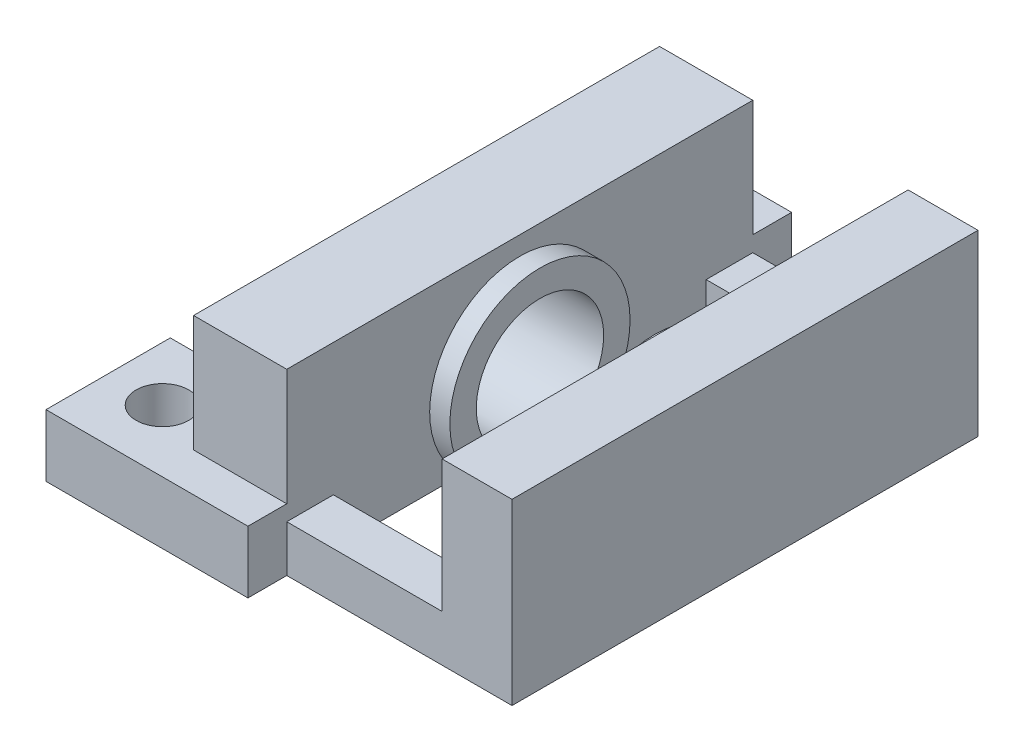
ISO-10303-21;
HEADER;
FILE_DESCRIPTION(('STEP AP214'),'2;1');
FILE_NAME('part.step','',(''),(''),'','','');
FILE_SCHEMA(('AUTOMOTIVE_DESIGN { 1 0 10303 214 1 1 1 1 }'));
ENDSEC;
DATA;
#1=APPLICATION_CONTEXT('core data for automotive mechanical design processes');
#2=APPLICATION_PROTOCOL_DEFINITION('international standard','automotive_design',2000,#1);
#3=PRODUCT_CONTEXT('',#1,'mechanical');
#4=PRODUCT('Part','Part','',(#3));
#5=PRODUCT_RELATED_PRODUCT_CATEGORY('part','',(#4));
#6=PRODUCT_DEFINITION_FORMATION('','',#4);
#7=PRODUCT_DEFINITION_CONTEXT('part definition',#1,'design');
#8=PRODUCT_DEFINITION('design','',#6,#7);
#9=PRODUCT_DEFINITION_SHAPE('','',#8);
#10=(LENGTH_UNIT() NAMED_UNIT(*) SI_UNIT(.MILLI.,.METRE.));
#11=(NAMED_UNIT(*) PLANE_ANGLE_UNIT() SI_UNIT($,.RADIAN.));
#12=(NAMED_UNIT(*) SI_UNIT($,.STERADIAN.) SOLID_ANGLE_UNIT());
#13=UNCERTAINTY_MEASURE_WITH_UNIT(LENGTH_MEASURE(1.E-05),#10,'distance_accuracy_value','');
#14=(GEOMETRIC_REPRESENTATION_CONTEXT(3) GLOBAL_UNCERTAINTY_ASSIGNED_CONTEXT((#13)) GLOBAL_UNIT_ASSIGNED_CONTEXT((#10,
#11,#12)) REPRESENTATION_CONTEXT('',''));
#15=CARTESIAN_POINT('',(0.,0.,0.));
#16=DIRECTION('',(0.,0.,1.));
#17=DIRECTION('',(1.,0.,0.));
#18=AXIS2_PLACEMENT_3D('',#15,#16,#17);
#19=CARTESIAN_POINT('',(163.,9.5,-85.));
#20=DIRECTION('',(1.,0.,0.));
#21=DIRECTION('',(0.,1.,0.));
#22=AXIS2_PLACEMENT_3D('',#19,#20,#21);
#23=PLANE('',#22);
#24=CARTESIAN_POINT('',(163.,9.5,-85.));
#25=DIRECTION('',(1.,0.,0.));
#26=DIRECTION('',(0.,0.,-1.));
#27=AXIS2_PLACEMENT_3D('',#24,#25,#26);
#28=CIRCLE('',#27,4.1);
#29=CARTESIAN_POINT('',(163.,9.5,-89.1));
#30=VERTEX_POINT('',#29);
#31=EDGE_CURVE('E11',#30,#30,#28,.T.);
#32=ORIENTED_EDGE('',*,*,#31,.F.);
#33=EDGE_LOOP('',(#32));
#34=FACE_BOUND('',#33,.T.);
#35=ADVANCED_FACE('F17',(#34),#23,.F.);
#36=CARTESIAN_POINT('',(143.,9.5,-85.));
#37=DIRECTION('',(-1.,0.,0.));
#38=DIRECTION('',(0.,0.,-1.));
#39=AXIS2_PLACEMENT_3D('',#36,#37,#38);
#40=CYLINDRICAL_SURFACE('',#39,4.1);
#41=CARTESIAN_POINT('',(158.7,9.5,-85.));
#42=DIRECTION('',(-1.,0.,0.));
#43=DIRECTION('',(0.,0.,-1.));
#44=AXIS2_PLACEMENT_3D('',#41,#42,#43);
#45=CIRCLE('',#44,4.1);
#46=CARTESIAN_POINT('',(158.7,9.5,-89.1));
#47=VERTEX_POINT('',#46);
#48=EDGE_CURVE('E346',#47,#47,#45,.T.);
#49=ORIENTED_EDGE('',*,*,#48,.T.);
#50=DIRECTION('',(1.,0.,0.));
#51=VECTOR('',#50,1.);
#52=CARTESIAN_POINT('',(143.,9.5,-89.1));
#53=LINE('',#52,#51);
#54=EDGE_CURVE('E25',#47,#30,#53,.T.);
#55=ORIENTED_EDGE('',*,*,#54,.T.);
#56=ORIENTED_EDGE('',*,*,#31,.T.);
#57=ORIENTED_EDGE('',*,*,#54,.F.);
#58=EDGE_LOOP('',(#49,#55,#56,#57));
#59=FACE_BOUND('',#58,.T.);
#60=ADVANCED_FACE('F355',(#59),#40,.F.);
#61=CARTESIAN_POINT('',(158.7,9.5,-85.));
#62=DIRECTION('',(1.,0.,0.));
#63=DIRECTION('',(0.,1.,0.));
#64=AXIS2_PLACEMENT_3D('',#61,#62,#63);
#65=PLANE('',#64);
#66=ORIENTED_EDGE('',*,*,#48,.F.);
#67=EDGE_LOOP('',(#66));
#68=FACE_BOUND('',#67,.T.);
#69=CARTESIAN_POINT('',(158.7,9.5,-85.));
#70=DIRECTION('',(1.,0.,0.));
#71=DIRECTION('',(0.,0.,-1.));
#72=AXIS2_PLACEMENT_3D('',#69,#70,#71);
#73=CIRCLE('',#72,5.8);
#74=CARTESIAN_POINT('',(158.7,9.5,-90.8));
#75=VERTEX_POINT('',#74);
#76=EDGE_CURVE('E350',#75,#75,#73,.T.);
#77=ORIENTED_EDGE('',*,*,#76,.F.);
#78=EDGE_LOOP('',(#77));
#79=FACE_BOUND('',#78,.T.);
#80=ADVANCED_FACE('F354',(#68,#79),#65,.F.);
#81=CARTESIAN_POINT('',(151.3,9.5,-85.));
#82=DIRECTION('',(1.,0.,0.));
#83=DIRECTION('',(0.,1.,0.));
#84=AXIS2_PLACEMENT_3D('',#81,#82,#83);
#85=PLANE('',#84);
#86=CARTESIAN_POINT('',(151.3,9.5,-85.));
#87=DIRECTION('',(-1.,0.,0.));
#88=DIRECTION('',(0.,0.,-1.));
#89=AXIS2_PLACEMENT_3D('',#86,#87,#88);
#90=CIRCLE('',#89,4.1);
#91=CARTESIAN_POINT('',(151.3,9.5,-89.1));
#92=VERTEX_POINT('',#91);
#93=EDGE_CURVE('E194',#92,#92,#90,.T.);
#94=ORIENTED_EDGE('',*,*,#93,.T.);
#95=EDGE_LOOP('',(#94));
#96=FACE_BOUND('',#95,.T.);
#97=CARTESIAN_POINT('',(151.3,9.5,-85.));
#98=DIRECTION('',(1.,0.,0.));
#99=DIRECTION('',(0.,0.,-1.));
#100=AXIS2_PLACEMENT_3D('',#97,#98,#99);
#101=CIRCLE('',#100,5.8);
#102=CARTESIAN_POINT('',(151.3,9.5,-90.8));
#103=VERTEX_POINT('',#102);
#104=EDGE_CURVE('E205',#103,#103,#101,.T.);
#105=ORIENTED_EDGE('',*,*,#104,.T.);
#106=EDGE_LOOP('',(#105));
#107=FACE_BOUND('',#106,.T.);
#108=ADVANCED_FACE('F359',(#96,#107),#85,.T.);
#109=CARTESIAN_POINT('',(160.,9.5,-85.));
#110=DIRECTION('',(1.,0.,0.));
#111=DIRECTION('',(0.,0.,-1.));
#112=AXIS2_PLACEMENT_3D('',#109,#110,#111);
#113=CYLINDRICAL_SURFACE('',#112,5.8);
#114=CARTESIAN_POINT('',(160.,9.5,-85.));
#115=DIRECTION('',(1.,0.,0.));
#116=DIRECTION('',(0.,0.,-1.));
#117=AXIS2_PLACEMENT_3D('',#114,#115,#116);
#118=CIRCLE('',#117,5.8);
#119=CARTESIAN_POINT('',(160.,9.5,-90.8));
#120=VERTEX_POINT('',#119);
#121=CARTESIAN_POINT('',(160.,5.,-81.34076510729));
#122=VERTEX_POINT('',#121);
#123=EDGE_CURVE('E320',#120,#122,#118,.T.);
#124=ORIENTED_EDGE('',*,*,#123,.F.);
#125=DIRECTION('',(-1.,0.,0.));
#126=VECTOR('',#125,1.);
#127=CARTESIAN_POINT('',(160.,9.5,-90.8));
#128=LINE('',#127,#126);
#129=EDGE_CURVE('E345',#120,#75,#128,.T.);
#130=ORIENTED_EDGE('',*,*,#129,.T.);
#131=ORIENTED_EDGE('',*,*,#76,.T.);
#132=ORIENTED_EDGE('',*,*,#129,.F.);
#133=CARTESIAN_POINT('',(160.,9.5,-85.));
#134=DIRECTION('',(1.,0.,0.));
#135=DIRECTION('',(0.,0.,-1.));
#136=AXIS2_PLACEMENT_3D('',#133,#134,#135);
#137=CIRCLE('',#136,5.8);
#138=CARTESIAN_POINT('',(160.,5.,-88.6592348927));
#139=VERTEX_POINT('',#138);
#140=EDGE_CURVE('E311',#139,#120,#137,.T.);
#141=ORIENTED_EDGE('',*,*,#140,.F.);
#142=CARTESIAN_POINT('',(160.,9.5,-85.));
#143=DIRECTION('',(1.,0.,0.));
#144=DIRECTION('',(0.,0.,-1.));
#145=AXIS2_PLACEMENT_3D('',#142,#143,#144);
#146=CIRCLE('',#145,5.8);
#147=EDGE_CURVE('E324',#122,#139,#146,.T.);
#148=ORIENTED_EDGE('',*,*,#147,.F.);
#149=EDGE_LOOP('',(#124,#130,#131,#132,#141,#148));
#150=FACE_BOUND('',#149,.T.);
#151=ADVANCED_FACE('F364',(#150),#113,.T.);
#152=CARTESIAN_POINT('',(162.25,16.5,-85.));
#153=DIRECTION('',(0.,1.,0.));
#154=DIRECTION('',(0.,0.,-1.));
#155=AXIS2_PLACEMENT_3D('',#152,#153,#154);
#156=PLANE('',#155);
#157=DIRECTION('',(1.,0.,0.));
#158=VECTOR('',#157,1.);
#159=CARTESIAN_POINT('',(160.,16.5,-70.));
#160=LINE('',#159,#158);
#161=CARTESIAN_POINT('',(160.,16.5,-70.));
#162=VERTEX_POINT('',#161);
#163=CARTESIAN_POINT('',(164.5,16.5,-70.));
#164=VERTEX_POINT('',#163);
#165=EDGE_CURVE('E529',#162,#164,#160,.T.);
#166=ORIENTED_EDGE('',*,*,#165,.T.);
#167=DIRECTION('',(0.,0.,-1.));
#168=VECTOR('',#167,1.);
#169=CARTESIAN_POINT('',(164.5,16.5,-70.));
#170=LINE('',#169,#168);
#171=CARTESIAN_POINT('',(164.5,16.5,-100.));
#172=VERTEX_POINT('',#171);
#173=EDGE_CURVE('E265',#164,#172,#170,.T.);
#174=ORIENTED_EDGE('',*,*,#173,.T.);
#175=DIRECTION('',(-1.,0.,0.));
#176=VECTOR('',#175,1.);
#177=CARTESIAN_POINT('',(164.5,16.5,-100.));
#178=LINE('',#177,#176);
#179=CARTESIAN_POINT('',(160.,16.5,-100.));
#180=VERTEX_POINT('',#179);
#181=EDGE_CURVE('E287',#172,#180,#178,.T.);
#182=ORIENTED_EDGE('',*,*,#181,.T.);
#183=DIRECTION('',(0.,0.,1.));
#184=VECTOR('',#183,1.);
#185=CARTESIAN_POINT('',(160.,16.5,-100.));
#186=LINE('',#185,#184);
#187=EDGE_CURVE('E318',#180,#162,#186,.T.);
#188=ORIENTED_EDGE('',*,*,#187,.T.);
#189=EDGE_LOOP('',(#166,#174,#182,#188));
#190=FACE_BOUND('',#189,.T.);
#191=ADVANCED_FACE('F550',(#190),#156,.T.);
#192=CARTESIAN_POINT('',(154.25,8.,-71.5));
#193=DIRECTION('',(0.,1.,0.));
#194=DIRECTION('',(0.,0.,-1.));
#195=AXIS2_PLACEMENT_3D('',#192,#193,#194);
#196=PLANE('',#195);
#197=DIRECTION('',(0.,0.,-1.));
#198=VECTOR('',#197,1.);
#199=CARTESIAN_POINT('',(150.,8.,-70.75));
#200=LINE('',#199,#198);
#201=CARTESIAN_POINT('',(150.,8.,-70.));
#202=VERTEX_POINT('',#201);
#203=CARTESIAN_POINT('',(150.,8.,-73.));
#204=VERTEX_POINT('',#203);
#205=EDGE_CURVE('E516',#202,#204,#200,.T.);
#206=ORIENTED_EDGE('',*,*,#205,.F.);
#207=DIRECTION('',(1.,0.,0.));
#208=VECTOR('',#207,1.);
#209=CARTESIAN_POINT('',(144.,8.,-70.));
#210=LINE('',#209,#208);
#211=CARTESIAN_POINT('',(160.,8.,-70.));
#212=VERTEX_POINT('',#211);
#213=EDGE_CURVE('E267',#202,#212,#210,.T.);
#214=ORIENTED_EDGE('',*,*,#213,.T.);
#215=DIRECTION('',(0.,0.,1.));
#216=VECTOR('',#215,1.);
#217=CARTESIAN_POINT('',(160.,8.,-85.75));
#218=LINE('',#217,#216);
#219=CARTESIAN_POINT('',(160.,8.,-73.));
#220=VERTEX_POINT('',#219);
#221=EDGE_CURVE('E325',#220,#212,#218,.T.);
#222=ORIENTED_EDGE('',*,*,#221,.F.);
#223=DIRECTION('',(-1.,0.,0.));
#224=VECTOR('',#223,1.);
#225=CARTESIAN_POINT('',(164.5,8.,-73.));
#226=LINE('',#225,#224);
#227=EDGE_CURVE('E310',#220,#204,#226,.T.);
#228=ORIENTED_EDGE('',*,*,#227,.T.);
#229=EDGE_LOOP('',(#206,#214,#222,#228));
#230=FACE_BOUND('',#229,.T.);
#231=ADVANCED_FACE('F868',(#230),#196,.T.);
#232=CARTESIAN_POINT('',(154.25,8.,-98.5));
#233=DIRECTION('',(0.,1.,0.));
#234=DIRECTION('',(0.,0.,-1.));
#235=AXIS2_PLACEMENT_3D('',#232,#233,#234);
#236=PLANE('',#235);
#237=DIRECTION('',(0.,0.,-1.));
#238=VECTOR('',#237,1.);
#239=CARTESIAN_POINT('',(150.,8.,-84.25));
#240=LINE('',#239,#238);
#241=CARTESIAN_POINT('',(150.,8.,-97.));
#242=VERTEX_POINT('',#241);
#243=CARTESIAN_POINT('',(150.,8.,-100.));
#244=VERTEX_POINT('',#243);
#245=EDGE_CURVE('E397',#242,#244,#240,.T.);
#246=ORIENTED_EDGE('',*,*,#245,.F.);
#247=DIRECTION('',(1.,0.,0.));
#248=VECTOR('',#247,1.);
#249=CARTESIAN_POINT('',(144.,8.,-97.));
#250=LINE('',#249,#248);
#251=CARTESIAN_POINT('',(160.,8.,-97.));
#252=VERTEX_POINT('',#251);
#253=EDGE_CURVE('E303',#242,#252,#250,.T.);
#254=ORIENTED_EDGE('',*,*,#253,.T.);
#255=DIRECTION('',(0.,0.,1.));
#256=VECTOR('',#255,1.);
#257=CARTESIAN_POINT('',(160.,8.,-99.25));
#258=LINE('',#257,#256);
#259=CARTESIAN_POINT('',(160.,8.,-100.));
#260=VERTEX_POINT('',#259);
#261=EDGE_CURVE('E321',#260,#252,#258,.T.);
#262=ORIENTED_EDGE('',*,*,#261,.F.);
#263=DIRECTION('',(-1.,0.,0.));
#264=VECTOR('',#263,1.);
#265=CARTESIAN_POINT('',(164.5,8.,-100.));
#266=LINE('',#265,#264);
#267=EDGE_CURVE('E248',#260,#244,#266,.T.);
#268=ORIENTED_EDGE('',*,*,#267,.T.);
#269=EDGE_LOOP('',(#246,#254,#262,#268));
#270=FACE_BOUND('',#269,.T.);
#271=ADVANCED_FACE('F876',(#270),#236,.T.);
#272=CARTESIAN_POINT('',(150.,9.5,-85.));
#273=DIRECTION('',(-1.,0.,0.));
#274=DIRECTION('',(0.,0.,-1.));
#275=AXIS2_PLACEMENT_3D('',#272,#273,#274);
#276=CYLINDRICAL_SURFACE('',#275,5.8);
#277=CARTESIAN_POINT('',(150.,9.5,-85.));
#278=DIRECTION('',(1.,0.,0.));
#279=DIRECTION('',(0.,0.,-1.));
#280=AXIS2_PLACEMENT_3D('',#277,#278,#279);
#281=CIRCLE('',#280,5.8);
#282=CARTESIAN_POINT('',(150.,5.,-81.34076510729));
#283=VERTEX_POINT('',#282);
#284=CARTESIAN_POINT('',(150.,5.,-88.6592348927));
#285=VERTEX_POINT('',#284);
#286=EDGE_CURVE('E297',#283,#285,#281,.T.);
#287=ORIENTED_EDGE('',*,*,#286,.T.);
#288=CARTESIAN_POINT('',(150.,9.5,-85.));
#289=DIRECTION('',(1.,0.,0.));
#290=DIRECTION('',(0.,0.,-1.));
#291=AXIS2_PLACEMENT_3D('',#288,#289,#290);
#292=CIRCLE('',#291,5.8);
#293=CARTESIAN_POINT('',(150.,9.5,-90.8));
#294=VERTEX_POINT('',#293);
#295=EDGE_CURVE('E485',#285,#294,#292,.T.);
#296=ORIENTED_EDGE('',*,*,#295,.T.);
#297=DIRECTION('',(1.,0.,0.));
#298=VECTOR('',#297,1.);
#299=CARTESIAN_POINT('',(150.,9.5,-90.8));
#300=LINE('',#299,#298);
#301=EDGE_CURVE('E339',#294,#103,#300,.T.);
#302=ORIENTED_EDGE('',*,*,#301,.T.);
#303=ORIENTED_EDGE('',*,*,#104,.F.);
#304=ORIENTED_EDGE('',*,*,#301,.F.);
#305=CARTESIAN_POINT('',(150.,9.5,-85.));
#306=DIRECTION('',(1.,0.,0.));
#307=DIRECTION('',(0.,0.,-1.));
#308=AXIS2_PLACEMENT_3D('',#305,#306,#307);
#309=CIRCLE('',#308,5.8);
#310=EDGE_CURVE('E476',#294,#283,#309,.T.);
#311=ORIENTED_EDGE('',*,*,#310,.T.);
#312=EDGE_LOOP('',(#287,#296,#302,#303,#304,#311));
#313=FACE_BOUND('',#312,.T.);
#314=ADVANCED_FACE('F883',(#313),#276,.T.);
#315=CARTESIAN_POINT('',(143.,9.5,-85.));
#316=DIRECTION('',(-1.,0.,0.));
#317=DIRECTION('',(0.,0.,-1.));
#318=AXIS2_PLACEMENT_3D('',#315,#316,#317);
#319=CYLINDRICAL_SURFACE('',#318,4.1);
#320=CARTESIAN_POINT('',(144.,9.5,-85.));
#321=DIRECTION('',(-1.,0.,0.));
#322=DIRECTION('',(0.,0.,-1.));
#323=AXIS2_PLACEMENT_3D('',#320,#321,#322);
#324=CIRCLE('',#323,4.1);
#325=CARTESIAN_POINT('',(144.,9.5,-89.1));
#326=VERTEX_POINT('',#325);
#327=EDGE_CURVE('E475',#326,#326,#324,.T.);
#328=ORIENTED_EDGE('',*,*,#327,.T.);
#329=DIRECTION('',(1.,0.,0.));
#330=VECTOR('',#329,1.);
#331=CARTESIAN_POINT('',(143.,9.5,-89.1));
#332=LINE('',#331,#330);
#333=EDGE_CURVE('E331',#326,#92,#332,.T.);
#334=ORIENTED_EDGE('',*,*,#333,.T.);
#335=ORIENTED_EDGE('',*,*,#93,.F.);
#336=ORIENTED_EDGE('',*,*,#333,.F.);
#337=EDGE_LOOP('',(#328,#334,#335,#336));
#338=FACE_BOUND('',#337,.T.);
#339=ADVANCED_FACE('F892',(#338),#319,.F.);
#340=CARTESIAN_POINT('',(143.5,9.,-98.5));
#341=DIRECTION('',(0.,1.,0.));
#342=DIRECTION('',(0.,0.,-1.));
#343=AXIS2_PLACEMENT_3D('',#340,#341,#342);
#344=PLANE('',#343);
#345=CARTESIAN_POINT('',(140.5,9.,-98.5));
#346=DIRECTION('',(0.,1.,0.));
#347=DIRECTION('',(1.,0.,0.));
#348=AXIS2_PLACEMENT_3D('',#345,#346,#347);
#349=CIRCLE('',#348,1.7);
#350=CARTESIAN_POINT('',(142.2,9.,-98.5));
#351=VERTEX_POINT('',#350);
#352=EDGE_CURVE('E448',#351,#351,#349,.T.);
#353=ORIENTED_EDGE('',*,*,#352,.F.);
#354=EDGE_LOOP('',(#353));
#355=FACE_BOUND('',#354,.T.);
#356=DIRECTION('',(0.,0.,1.));
#357=VECTOR('',#356,1.);
#358=CARTESIAN_POINT('',(137.,9.,-102.5));
#359=LINE('',#358,#357);
#360=CARTESIAN_POINT('',(137.,9.,-102.5));
#361=VERTEX_POINT('',#360);
#362=CARTESIAN_POINT('',(137.,9.,-94.5));
#363=VERTEX_POINT('',#362);
#364=EDGE_CURVE('E245',#361,#363,#359,.T.);
#365=ORIENTED_EDGE('',*,*,#364,.T.);
#366=DIRECTION('',(1.,0.,0.));
#367=VECTOR('',#366,1.);
#368=CARTESIAN_POINT('',(137.,9.,-94.5));
#369=LINE('',#368,#367);
#370=CARTESIAN_POINT('',(144.,9.,-94.5));
#371=VERTEX_POINT('',#370);
#372=EDGE_CURVE('E528',#363,#371,#369,.T.);
#373=ORIENTED_EDGE('',*,*,#372,.T.);
#374=DIRECTION('',(0.,0.,1.));
#375=VECTOR('',#374,1.);
#376=CARTESIAN_POINT('',(144.,9.,-99.25));
#377=LINE('',#376,#375);
#378=CARTESIAN_POINT('',(144.,9.,-100.));
#379=VERTEX_POINT('',#378);
#380=EDGE_CURVE('E449',#379,#371,#377,.T.);
#381=ORIENTED_EDGE('',*,*,#380,.F.);
#382=DIRECTION('',(-1.,0.,0.));
#383=VECTOR('',#382,1.);
#384=CARTESIAN_POINT('',(146.75,9.,-100.));
#385=LINE('',#384,#383);
#386=CARTESIAN_POINT('',(150.,9.,-100.));
#387=VERTEX_POINT('',#386);
#388=EDGE_CURVE('E335',#387,#379,#385,.T.);
#389=ORIENTED_EDGE('',*,*,#388,.F.);
#390=DIRECTION('',(0.,0.,-1.));
#391=VECTOR('',#390,1.);
#392=CARTESIAN_POINT('',(150.,9.,-94.5));
#393=LINE('',#392,#391);
#394=CARTESIAN_POINT('',(150.,9.,-102.5));
#395=VERTEX_POINT('',#394);
#396=EDGE_CURVE('E247',#387,#395,#393,.T.);
#397=ORIENTED_EDGE('',*,*,#396,.T.);
#398=DIRECTION('',(-1.,0.,0.));
#399=VECTOR('',#398,1.);
#400=CARTESIAN_POINT('',(150.,9.,-102.5));
#401=LINE('',#400,#399);
#402=EDGE_CURVE('E238',#395,#361,#401,.T.);
#403=ORIENTED_EDGE('',*,*,#402,.T.);
#404=EDGE_LOOP('',(#365,#373,#381,#389,#397,#403));
#405=FACE_BOUND('',#404,.T.);
#406=ADVANCED_FACE('F239',(#355,#405),#344,.T.);
#407=CARTESIAN_POINT('',(144.,5.,-70.));
#408=DIRECTION('',(0.,0.,-1.));
#409=DIRECTION('',(-1.,0.,0.));
#410=AXIS2_PLACEMENT_3D('',#407,#408,#409);
#411=PLANE('',#410);
#412=DIRECTION('',(0.,1.,0.));
#413=VECTOR('',#412,1.);
#414=CARTESIAN_POINT('',(150.,5.,-70.));
#415=LINE('',#414,#413);
#416=CARTESIAN_POINT('',(150.,9.,-70.));
#417=VERTEX_POINT('',#416);
#418=CARTESIAN_POINT('',(150.,16.5,-70.));
#419=VERTEX_POINT('',#418);
#420=EDGE_CURVE('E498',#417,#419,#415,.T.);
#421=ORIENTED_EDGE('',*,*,#420,.T.);
#422=DIRECTION('',(1.,0.,0.));
#423=VECTOR('',#422,1.);
#424=CARTESIAN_POINT('',(144.,16.5,-70.));
#425=LINE('',#424,#423);
#426=CARTESIAN_POINT('',(144.,16.5,-70.));
#427=VERTEX_POINT('',#426);
#428=EDGE_CURVE('E334',#427,#419,#425,.T.);
#429=ORIENTED_EDGE('',*,*,#428,.F.);
#430=DIRECTION('',(0.,-1.,0.));
#431=VECTOR('',#430,1.);
#432=CARTESIAN_POINT('',(144.,16.5,-70.));
#433=LINE('',#432,#431);
#434=CARTESIAN_POINT('',(144.,9.,-70.));
#435=VERTEX_POINT('',#434);
#436=EDGE_CURVE('E462',#427,#435,#433,.T.);
#437=ORIENTED_EDGE('',*,*,#436,.T.);
#438=DIRECTION('',(1.,0.,0.));
#439=VECTOR('',#438,1.);
#440=CARTESIAN_POINT('',(143.75,9.,-70.));
#441=LINE('',#440,#439);
#442=EDGE_CURVE('E427',#435,#417,#441,.T.);
#443=ORIENTED_EDGE('',*,*,#442,.T.);
#444=EDGE_LOOP('',(#421,#429,#437,#443));
#445=FACE_BOUND('',#444,.T.);
#446=ADVANCED_FACE('F913',(#445),#411,.F.);
#447=CARTESIAN_POINT('',(150.,5.,-100.));
#448=DIRECTION('',(0.,0.,1.));
#449=DIRECTION('',(0.,-1.,0.));
#450=AXIS2_PLACEMENT_3D('',#447,#448,#449);
#451=PLANE('',#450);
#452=DIRECTION('',(0.,1.,0.));
#453=VECTOR('',#452,1.);
#454=CARTESIAN_POINT('',(150.,5.,-100.));
#455=LINE('',#454,#453);
#456=CARTESIAN_POINT('',(150.,16.5,-100.));
#457=VERTEX_POINT('',#456);
#458=EDGE_CURVE('E495',#387,#457,#455,.T.);
#459=ORIENTED_EDGE('',*,*,#458,.F.);
#460=ORIENTED_EDGE('',*,*,#388,.T.);
#461=DIRECTION('',(0.,-1.,0.));
#462=VECTOR('',#461,1.);
#463=CARTESIAN_POINT('',(144.,16.5,-100.));
#464=LINE('',#463,#462);
#465=CARTESIAN_POINT('',(144.,16.5,-100.));
#466=VERTEX_POINT('',#465);
#467=EDGE_CURVE('E441',#466,#379,#464,.T.);
#468=ORIENTED_EDGE('',*,*,#467,.F.);
#469=DIRECTION('',(-1.,0.,0.));
#470=VECTOR('',#469,1.);
#471=CARTESIAN_POINT('',(150.,16.5,-100.));
#472=LINE('',#471,#470);
#473=EDGE_CURVE('E328',#457,#466,#472,.T.);
#474=ORIENTED_EDGE('',*,*,#473,.F.);
#475=EDGE_LOOP('',(#459,#460,#468,#474));
#476=FACE_BOUND('',#475,.T.);
#477=ADVANCED_FACE('F917',(#476),#451,.F.);
#478=CARTESIAN_POINT('',(147.,16.5,-85.));
#479=DIRECTION('',(0.,1.,0.));
#480=DIRECTION('',(0.,0.,-1.));
#481=AXIS2_PLACEMENT_3D('',#478,#479,#480);
#482=PLANE('',#481);
#483=ORIENTED_EDGE('',*,*,#428,.T.);
#484=DIRECTION('',(0.,0.,-1.));
#485=VECTOR('',#484,1.);
#486=CARTESIAN_POINT('',(150.,16.5,-70.));
#487=LINE('',#486,#485);
#488=EDGE_CURVE('E497',#419,#457,#487,.T.);
#489=ORIENTED_EDGE('',*,*,#488,.T.);
#490=ORIENTED_EDGE('',*,*,#473,.T.);
#491=DIRECTION('',(0.,0.,1.));
#492=VECTOR('',#491,1.);
#493=CARTESIAN_POINT('',(144.,16.5,-100.));
#494=LINE('',#493,#492);
#495=EDGE_CURVE('E468',#466,#427,#494,.T.);
#496=ORIENTED_EDGE('',*,*,#495,.T.);
#497=EDGE_LOOP('',(#483,#489,#490,#496));
#498=FACE_BOUND('',#497,.T.);
#499=ADVANCED_FACE('F927',(#498),#482,.T.);
#500=CARTESIAN_POINT('',(143.5,9.,-71.5));
#501=DIRECTION('',(0.,1.,0.));
#502=DIRECTION('',(0.,0.,-1.));
#503=AXIS2_PLACEMENT_3D('',#500,#501,#502);
#504=PLANE('',#503);
#505=CARTESIAN_POINT('',(140.5,9.,-71.5));
#506=DIRECTION('',(0.,1.,0.));
#507=DIRECTION('',(1.,0.,0.));
#508=AXIS2_PLACEMENT_3D('',#505,#506,#507);
#509=CIRCLE('',#508,1.7);
#510=CARTESIAN_POINT('',(142.2,9.,-71.5));
#511=VERTEX_POINT('',#510);
#512=EDGE_CURVE('E300',#511,#511,#509,.T.);
#513=ORIENTED_EDGE('',*,*,#512,.F.);
#514=EDGE_LOOP('',(#513));
#515=FACE_BOUND('',#514,.T.);
#516=DIRECTION('',(0.,0.,1.));
#517=VECTOR('',#516,1.);
#518=CARTESIAN_POINT('',(137.,9.,-75.5));
#519=LINE('',#518,#517);
#520=CARTESIAN_POINT('',(137.,9.,-75.5));
#521=VERTEX_POINT('',#520);
#522=CARTESIAN_POINT('',(137.,9.,-67.5));
#523=VERTEX_POINT('',#522);
#524=EDGE_CURVE('E402',#521,#523,#519,.T.);
#525=ORIENTED_EDGE('',*,*,#524,.T.);
#526=DIRECTION('',(1.,0.,0.));
#527=VECTOR('',#526,1.);
#528=CARTESIAN_POINT('',(137.,9.,-67.5));
#529=LINE('',#528,#527);
#530=CARTESIAN_POINT('',(150.,9.,-67.5));
#531=VERTEX_POINT('',#530);
#532=EDGE_CURVE('E438',#523,#531,#529,.T.);
#533=ORIENTED_EDGE('',*,*,#532,.T.);
#534=DIRECTION('',(0.,0.,-1.));
#535=VECTOR('',#534,1.);
#536=CARTESIAN_POINT('',(150.,9.,-67.5));
#537=LINE('',#536,#535);
#538=EDGE_CURVE('E503',#531,#417,#537,.T.);
#539=ORIENTED_EDGE('',*,*,#538,.T.);
#540=ORIENTED_EDGE('',*,*,#442,.F.);
#541=DIRECTION('',(0.,0.,1.));
#542=VECTOR('',#541,1.);
#543=CARTESIAN_POINT('',(144.,9.,-85.75));
#544=LINE('',#543,#542);
#545=CARTESIAN_POINT('',(144.,9.,-75.5));
#546=VERTEX_POINT('',#545);
#547=EDGE_CURVE('E457',#546,#435,#544,.T.);
#548=ORIENTED_EDGE('',*,*,#547,.F.);
#549=DIRECTION('',(-1.,0.,0.));
#550=VECTOR('',#549,1.);
#551=CARTESIAN_POINT('',(150.,9.,-75.5));
#552=LINE('',#551,#550);
#553=EDGE_CURVE('E403',#546,#521,#552,.T.);
#554=ORIENTED_EDGE('',*,*,#553,.T.);
#555=EDGE_LOOP('',(#525,#533,#539,#540,#548,#554));
#556=FACE_BOUND('',#555,.T.);
#557=ADVANCED_FACE('F939',(#515,#556),#504,.T.);
#558=CARTESIAN_POINT('',(140.5,5.,-98.5));
#559=DIRECTION('',(0.,-1.,0.));
#560=DIRECTION('',(1.,0.,0.));
#561=AXIS2_PLACEMENT_3D('',#558,#559,#560);
#562=CYLINDRICAL_SURFACE('',#561,1.7);
#563=DIRECTION('',(0.,1.,0.));
#564=VECTOR('',#563,1.);
#565=CARTESIAN_POINT('',(142.2,5.,-98.5));
#566=LINE('',#565,#564);
#567=CARTESIAN_POINT('',(142.2,5.,-98.5));
#568=VERTEX_POINT('',#567);
#569=EDGE_CURVE('E327',#568,#351,#566,.T.);
#570=ORIENTED_EDGE('',*,*,#569,.T.);
#571=ORIENTED_EDGE('',*,*,#352,.T.);
#572=ORIENTED_EDGE('',*,*,#569,.F.);
#573=CARTESIAN_POINT('',(140.5,5.,-98.5));
#574=DIRECTION('',(0.,1.,0.));
#575=DIRECTION('',(1.,0.,0.));
#576=AXIS2_PLACEMENT_3D('',#573,#574,#575);
#577=CIRCLE('',#576,1.7);
#578=EDGE_CURVE('E418',#568,#568,#577,.T.);
#579=ORIENTED_EDGE('',*,*,#578,.F.);
#580=EDGE_LOOP('',(#570,#571,#572,#579));
#581=FACE_BOUND('',#580,.T.);
#582=ADVANCED_FACE('F950',(#581),#562,.F.);
#583=CARTESIAN_POINT('',(160.,9.5,-85.));
#584=DIRECTION('',(1.,0.,0.));
#585=DIRECTION('',(0.,1.,0.));
#586=AXIS2_PLACEMENT_3D('',#583,#584,#585);
#587=PLANE('',#586);
#588=DIRECTION('',(0.,0.,1.));
#589=VECTOR('',#588,1.);
#590=CARTESIAN_POINT('',(160.,5.,-100.));
#591=LINE('',#590,#589);
#592=EDGE_CURVE('E377',#139,#122,#591,.T.);
#593=ORIENTED_EDGE('',*,*,#592,.T.);
#594=ORIENTED_EDGE('',*,*,#147,.T.);
#595=EDGE_LOOP('',(#593,#594));
#596=FACE_BOUND('',#595,.T.);
#597=ADVANCED_FACE('F956',(#596),#587,.T.);
#598=CARTESIAN_POINT('',(160.,5.,-100.));
#599=DIRECTION('',(1.,0.,0.));
#600=DIRECTION('',(0.,1.,0.));
#601=AXIS2_PLACEMENT_3D('',#598,#599,#600);
#602=PLANE('',#601);
#603=DIRECTION('',(0.,1.,0.));
#604=VECTOR('',#603,1.);
#605=CARTESIAN_POINT('',(160.,5.,-97.));
#606=LINE('',#605,#604);
#607=CARTESIAN_POINT('',(160.,5.,-97.));
#608=VERTEX_POINT('',#607);
#609=EDGE_CURVE('E302',#608,#252,#606,.T.);
#610=ORIENTED_EDGE('',*,*,#609,.F.);
#611=DIRECTION('',(0.,0.,1.));
#612=VECTOR('',#611,1.);
#613=CARTESIAN_POINT('',(160.,5.,-100.));
#614=LINE('',#613,#612);
#615=EDGE_CURVE('E371',#608,#139,#614,.T.);
#616=ORIENTED_EDGE('',*,*,#615,.T.);
#617=ORIENTED_EDGE('',*,*,#140,.T.);
#618=ORIENTED_EDGE('',*,*,#123,.T.);
#619=DIRECTION('',(0.,0.,1.));
#620=VECTOR('',#619,1.);
#621=CARTESIAN_POINT('',(160.,5.,-100.));
#622=LINE('',#621,#620);
#623=CARTESIAN_POINT('',(160.,5.,-73.));
#624=VERTEX_POINT('',#623);
#625=EDGE_CURVE('E389',#122,#624,#622,.T.);
#626=ORIENTED_EDGE('',*,*,#625,.T.);
#627=DIRECTION('',(0.,-1.,0.));
#628=VECTOR('',#627,1.);
#629=CARTESIAN_POINT('',(160.,5.,-73.));
#630=LINE('',#629,#628);
#631=EDGE_CURVE('E309',#220,#624,#630,.T.);
#632=ORIENTED_EDGE('',*,*,#631,.F.);
#633=ORIENTED_EDGE('',*,*,#221,.T.);
#634=DIRECTION('',(0.,1.,0.));
#635=VECTOR('',#634,1.);
#636=CARTESIAN_POINT('',(160.,5.,-70.));
#637=LINE('',#636,#635);
#638=EDGE_CURVE('E277',#212,#162,#637,.T.);
#639=ORIENTED_EDGE('',*,*,#638,.T.);
#640=ORIENTED_EDGE('',*,*,#187,.F.);
#641=DIRECTION('',(0.,1.,0.));
#642=VECTOR('',#641,1.);
#643=CARTESIAN_POINT('',(160.,5.,-100.));
#644=LINE('',#643,#642);
#645=EDGE_CURVE('E288',#260,#180,#644,.T.);
#646=ORIENTED_EDGE('',*,*,#645,.F.);
#647=ORIENTED_EDGE('',*,*,#261,.T.);
#648=EDGE_LOOP('',(#610,#616,#617,#618,#626,#632,#633,#639,#640,#646,#647));
#649=FACE_BOUND('',#648,.T.);
#650=ADVANCED_FACE('F373',(#649),#602,.F.);
#651=CARTESIAN_POINT('',(164.5,5.,-73.));
#652=DIRECTION('',(0.,0.,1.));
#653=DIRECTION('',(0.,-1.,0.));
#654=AXIS2_PLACEMENT_3D('',#651,#652,#653);
#655=PLANE('',#654);
#656=DIRECTION('',(0.,1.,0.));
#657=VECTOR('',#656,1.);
#658=CARTESIAN_POINT('',(150.,5.,-73.));
#659=LINE('',#658,#657);
#660=CARTESIAN_POINT('',(150.,5.,-73.));
#661=VERTEX_POINT('',#660);
#662=EDGE_CURVE('E525',#661,#204,#659,.T.);
#663=ORIENTED_EDGE('',*,*,#662,.T.);
#664=ORIENTED_EDGE('',*,*,#227,.F.);
#665=ORIENTED_EDGE('',*,*,#631,.T.);
#666=DIRECTION('',(-1.,0.,0.));
#667=VECTOR('',#666,1.);
#668=CARTESIAN_POINT('',(164.5,5.,-73.));
#669=LINE('',#668,#667);
#670=EDGE_CURVE('E395',#624,#661,#669,.T.);
#671=ORIENTED_EDGE('',*,*,#670,.T.);
#672=EDGE_LOOP('',(#663,#664,#665,#671));
#673=FACE_BOUND('',#672,.T.);
#674=ADVANCED_FACE('F975',(#673),#655,.F.);
#675=CARTESIAN_POINT('',(144.,5.,-97.));
#676=DIRECTION('',(0.,0.,-1.));
#677=DIRECTION('',(-1.,0.,0.));
#678=AXIS2_PLACEMENT_3D('',#675,#676,#677);
#679=PLANE('',#678);
#680=ORIENTED_EDGE('',*,*,#609,.T.);
#681=ORIENTED_EDGE('',*,*,#253,.F.);
#682=DIRECTION('',(0.,-1.,0.));
#683=VECTOR('',#682,1.);
#684=CARTESIAN_POINT('',(150.,5.,-97.));
#685=LINE('',#684,#683);
#686=CARTESIAN_POINT('',(150.,5.,-97.));
#687=VERTEX_POINT('',#686);
#688=EDGE_CURVE('E486',#242,#687,#685,.T.);
#689=ORIENTED_EDGE('',*,*,#688,.T.);
#690=DIRECTION('',(1.,0.,0.));
#691=VECTOR('',#690,1.);
#692=CARTESIAN_POINT('',(144.,5.,-97.));
#693=LINE('',#692,#691);
#694=EDGE_CURVE('E378',#687,#608,#693,.T.);
#695=ORIENTED_EDGE('',*,*,#694,.T.);
#696=EDGE_LOOP('',(#680,#681,#689,#695));
#697=FACE_BOUND('',#696,.T.);
#698=ADVANCED_FACE('F595',(#697),#679,.F.);
#699=CARTESIAN_POINT('',(150.,9.5,-85.));
#700=DIRECTION('',(1.,0.,0.));
#701=DIRECTION('',(0.,1.,0.));
#702=AXIS2_PLACEMENT_3D('',#699,#700,#701);
#703=PLANE('',#702);
#704=ORIENTED_EDGE('',*,*,#286,.F.);
#705=DIRECTION('',(0.,0.,1.));
#706=VECTOR('',#705,1.);
#707=CARTESIAN_POINT('',(150.,5.,-97.));
#708=LINE('',#707,#706);
#709=EDGE_CURVE('E601',#285,#283,#708,.T.);
#710=ORIENTED_EDGE('',*,*,#709,.F.);
#711=EDGE_LOOP('',(#704,#710));
#712=FACE_BOUND('',#711,.T.);
#713=ADVANCED_FACE('F602',(#712),#703,.F.);
#714=CARTESIAN_POINT('',(140.5,5.,-71.5));
#715=DIRECTION('',(0.,-1.,0.));
#716=DIRECTION('',(1.,0.,0.));
#717=AXIS2_PLACEMENT_3D('',#714,#715,#716);
#718=CYLINDRICAL_SURFACE('',#717,1.7);
#719=DIRECTION('',(0.,1.,0.));
#720=VECTOR('',#719,1.);
#721=CARTESIAN_POINT('',(142.2,5.,-71.5));
#722=LINE('',#721,#720);
#723=CARTESIAN_POINT('',(142.2,5.,-71.5));
#724=VERTEX_POINT('',#723);
#725=EDGE_CURVE('E293',#724,#511,#722,.T.);
#726=ORIENTED_EDGE('',*,*,#725,.T.);
#727=ORIENTED_EDGE('',*,*,#512,.T.);
#728=ORIENTED_EDGE('',*,*,#725,.F.);
#729=CARTESIAN_POINT('',(140.5,5.,-71.5));
#730=DIRECTION('',(0.,1.,0.));
#731=DIRECTION('',(1.,0.,0.));
#732=AXIS2_PLACEMENT_3D('',#729,#730,#731);
#733=CIRCLE('',#732,1.7);
#734=EDGE_CURVE('E607',#724,#724,#733,.T.);
#735=ORIENTED_EDGE('',*,*,#734,.F.);
#736=EDGE_LOOP('',(#726,#727,#728,#735));
#737=FACE_BOUND('',#736,.T.);
#738=ADVANCED_FACE('F981',(#737),#718,.F.);
#739=CARTESIAN_POINT('',(150.,5.,-100.));
#740=DIRECTION('',(0.,0.,1.));
#741=DIRECTION('',(0.,-1.,0.));
#742=AXIS2_PLACEMENT_3D('',#739,#740,#741);
#743=PLANE('',#742);
#744=ORIENTED_EDGE('',*,*,#267,.F.);
#745=ORIENTED_EDGE('',*,*,#645,.T.);
#746=ORIENTED_EDGE('',*,*,#181,.F.);
#747=DIRECTION('',(0.,-1.,0.));
#748=VECTOR('',#747,1.);
#749=CARTESIAN_POINT('',(164.5,16.5,-100.));
#750=LINE('',#749,#748);
#751=CARTESIAN_POINT('',(164.5,5.,-100.));
#752=VERTEX_POINT('',#751);
#753=EDGE_CURVE('E253',#172,#752,#750,.T.);
#754=ORIENTED_EDGE('',*,*,#753,.T.);
#755=DIRECTION('',(1.,0.,0.));
#756=VECTOR('',#755,1.);
#757=CARTESIAN_POINT('',(144.,5.,-100.));
#758=LINE('',#757,#756);
#759=CARTESIAN_POINT('',(150.,5.,-100.));
#760=VERTEX_POINT('',#759);
#761=EDGE_CURVE('E632',#760,#752,#758,.T.);
#762=ORIENTED_EDGE('',*,*,#761,.F.);
#763=DIRECTION('',(0.,-1.,0.));
#764=VECTOR('',#763,1.);
#765=CARTESIAN_POINT('',(150.,5.,-100.));
#766=LINE('',#765,#764);
#767=EDGE_CURVE('E408',#244,#760,#766,.T.);
#768=ORIENTED_EDGE('',*,*,#767,.F.);
#769=EDGE_LOOP('',(#744,#745,#746,#754,#762,#768));
#770=FACE_BOUND('',#769,.T.);
#771=ADVANCED_FACE('F995',(#770),#743,.F.);
#772=CARTESIAN_POINT('',(150.,5.,-102.5));
#773=DIRECTION('',(0.,0.,1.));
#774=DIRECTION('',(0.,-1.,0.));
#775=AXIS2_PLACEMENT_3D('',#772,#773,#774);
#776=PLANE('',#775);
#777=DIRECTION('',(-1.,0.,0.));
#778=VECTOR('',#777,1.);
#779=CARTESIAN_POINT('',(150.,5.,-102.5));
#780=LINE('',#779,#778);
#781=CARTESIAN_POINT('',(150.,5.,-102.5));
#782=VERTEX_POINT('',#781);
#783=CARTESIAN_POINT('',(137.,5.,-102.5));
#784=VERTEX_POINT('',#783);
#785=EDGE_CURVE('E260',#782,#784,#780,.T.);
#786=ORIENTED_EDGE('',*,*,#785,.T.);
#787=DIRECTION('',(0.,1.,0.));
#788=VECTOR('',#787,1.);
#789=CARTESIAN_POINT('',(137.,5.,-102.5));
#790=LINE('',#789,#788);
#791=EDGE_CURVE('E255',#784,#361,#790,.T.);
#792=ORIENTED_EDGE('',*,*,#791,.T.);
#793=ORIENTED_EDGE('',*,*,#402,.F.);
#794=DIRECTION('',(0.,1.,0.));
#795=VECTOR('',#794,1.);
#796=CARTESIAN_POINT('',(150.,5.,-102.5));
#797=LINE('',#796,#795);
#798=EDGE_CURVE('E406',#782,#395,#797,.T.);
#799=ORIENTED_EDGE('',*,*,#798,.F.);
#800=EDGE_LOOP('',(#786,#792,#793,#799));
#801=FACE_BOUND('',#800,.T.);
#802=ADVANCED_FACE('F254',(#801),#776,.F.);
#803=CARTESIAN_POINT('',(164.5,5.,-70.));
#804=DIRECTION('',(-1.,0.,0.));
#805=DIRECTION('',(0.,0.,1.));
#806=AXIS2_PLACEMENT_3D('',#803,#804,#805);
#807=PLANE('',#806);
#808=ORIENTED_EDGE('',*,*,#173,.F.);
#809=DIRECTION('',(0.,1.,0.));
#810=VECTOR('',#809,1.);
#811=CARTESIAN_POINT('',(164.5,5.,-70.));
#812=LINE('',#811,#810);
#813=CARTESIAN_POINT('',(164.5,5.,-70.));
#814=VERTEX_POINT('',#813);
#815=EDGE_CURVE('E523',#814,#164,#812,.T.);
#816=ORIENTED_EDGE('',*,*,#815,.F.);
#817=DIRECTION('',(0.,0.,1.));
#818=VECTOR('',#817,1.);
#819=CARTESIAN_POINT('',(164.5,5.,-100.));
#820=LINE('',#819,#818);
#821=EDGE_CURVE('E633',#752,#814,#820,.T.);
#822=ORIENTED_EDGE('',*,*,#821,.F.);
#823=ORIENTED_EDGE('',*,*,#753,.F.);
#824=EDGE_LOOP('',(#808,#816,#822,#823));
#825=FACE_BOUND('',#824,.T.);
#826=ADVANCED_FACE('F992',(#825),#807,.F.);
#827=CARTESIAN_POINT('',(137.,5.,-102.5));
#828=DIRECTION('',(1.,0.,0.));
#829=DIRECTION('',(0.,1.,0.));
#830=AXIS2_PLACEMENT_3D('',#827,#828,#829);
#831=PLANE('',#830);
#832=DIRECTION('',(0.,0.,1.));
#833=VECTOR('',#832,1.);
#834=CARTESIAN_POINT('',(137.,5.,-102.5));
#835=LINE('',#834,#833);
#836=CARTESIAN_POINT('',(137.,5.,-94.5));
#837=VERTEX_POINT('',#836);
#838=EDGE_CURVE('E630',#784,#837,#835,.T.);
#839=ORIENTED_EDGE('',*,*,#838,.T.);
#840=DIRECTION('',(0.,1.,0.));
#841=VECTOR('',#840,1.);
#842=CARTESIAN_POINT('',(137.,5.,-94.5));
#843=LINE('',#842,#841);
#844=EDGE_CURVE('E266',#837,#363,#843,.T.);
#845=ORIENTED_EDGE('',*,*,#844,.T.);
#846=ORIENTED_EDGE('',*,*,#364,.F.);
#847=ORIENTED_EDGE('',*,*,#791,.F.);
#848=EDGE_LOOP('',(#839,#845,#846,#847));
#849=FACE_BOUND('',#848,.T.);
#850=ADVANCED_FACE('F262',(#849),#831,.F.);
#851=CARTESIAN_POINT('',(144.,5.,-70.));
#852=DIRECTION('',(0.,0.,-1.));
#853=DIRECTION('',(-1.,0.,0.));
#854=AXIS2_PLACEMENT_3D('',#851,#852,#853);
#855=PLANE('',#854);
#856=ORIENTED_EDGE('',*,*,#815,.T.);
#857=ORIENTED_EDGE('',*,*,#165,.F.);
#858=ORIENTED_EDGE('',*,*,#638,.F.);
#859=ORIENTED_EDGE('',*,*,#213,.F.);
#860=DIRECTION('',(0.,1.,0.));
#861=VECTOR('',#860,1.);
#862=CARTESIAN_POINT('',(150.,5.,-70.));
#863=LINE('',#862,#861);
#864=CARTESIAN_POINT('',(150.,5.,-70.));
#865=VERTEX_POINT('',#864);
#866=EDGE_CURVE('E509',#865,#202,#863,.T.);
#867=ORIENTED_EDGE('',*,*,#866,.F.);
#868=DIRECTION('',(1.,0.,0.));
#869=VECTOR('',#868,1.);
#870=CARTESIAN_POINT('',(144.,5.,-70.));
#871=LINE('',#870,#869);
#872=EDGE_CURVE('E643',#865,#814,#871,.T.);
#873=ORIENTED_EDGE('',*,*,#872,.T.);
#874=EDGE_LOOP('',(#856,#857,#858,#859,#867,#873));
#875=FACE_BOUND('',#874,.T.);
#876=ADVANCED_FACE('F542',(#875),#855,.F.);
#877=CARTESIAN_POINT('',(137.,5.,-94.5));
#878=DIRECTION('',(0.,0.,-1.));
#879=DIRECTION('',(-1.,0.,0.));
#880=AXIS2_PLACEMENT_3D('',#877,#878,#879);
#881=PLANE('',#880);
#882=DIRECTION('',(0.,1.,0.));
#883=VECTOR('',#882,1.);
#884=CARTESIAN_POINT('',(144.,5.,-94.5));
#885=LINE('',#884,#883);
#886=CARTESIAN_POINT('',(144.,5.,-94.5));
#887=VERTEX_POINT('',#886);
#888=EDGE_CURVE('E454',#887,#371,#885,.T.);
#889=ORIENTED_EDGE('',*,*,#888,.T.);
#890=ORIENTED_EDGE('',*,*,#372,.F.);
#891=ORIENTED_EDGE('',*,*,#844,.F.);
#892=DIRECTION('',(1.,0.,0.));
#893=VECTOR('',#892,1.);
#894=CARTESIAN_POINT('',(137.,5.,-94.5));
#895=LINE('',#894,#893);
#896=EDGE_CURVE('E674',#837,#887,#895,.T.);
#897=ORIENTED_EDGE('',*,*,#896,.T.);
#898=EDGE_LOOP('',(#889,#890,#891,#897));
#899=FACE_BOUND('',#898,.T.);
#900=ADVANCED_FACE('F693',(#899),#881,.F.);
#901=CARTESIAN_POINT('',(150.,5.,-70.));
#902=DIRECTION('',(-1.,0.,0.));
#903=DIRECTION('',(0.,0.,1.));
#904=AXIS2_PLACEMENT_3D('',#901,#902,#903);
#905=PLANE('',#904);
#906=ORIENTED_EDGE('',*,*,#310,.F.);
#907=ORIENTED_EDGE('',*,*,#295,.F.);
#908=DIRECTION('',(0.,0.,1.));
#909=VECTOR('',#908,1.);
#910=CARTESIAN_POINT('',(150.,5.,-97.));
#911=LINE('',#910,#909);
#912=EDGE_CURVE('E415',#687,#285,#911,.T.);
#913=ORIENTED_EDGE('',*,*,#912,.F.);
#914=ORIENTED_EDGE('',*,*,#688,.F.);
#915=ORIENTED_EDGE('',*,*,#245,.T.);
#916=ORIENTED_EDGE('',*,*,#767,.T.);
#917=DIRECTION('',(0.,0.,-1.));
#918=VECTOR('',#917,1.);
#919=CARTESIAN_POINT('',(150.,5.,-94.5));
#920=LINE('',#919,#918);
#921=EDGE_CURVE('E626',#760,#782,#920,.T.);
#922=ORIENTED_EDGE('',*,*,#921,.T.);
#923=ORIENTED_EDGE('',*,*,#798,.T.);
#924=ORIENTED_EDGE('',*,*,#396,.F.);
#925=ORIENTED_EDGE('',*,*,#458,.T.);
#926=ORIENTED_EDGE('',*,*,#488,.F.);
#927=ORIENTED_EDGE('',*,*,#420,.F.);
#928=ORIENTED_EDGE('',*,*,#538,.F.);
#929=DIRECTION('',(0.,1.,0.));
#930=VECTOR('',#929,1.);
#931=CARTESIAN_POINT('',(150.,5.,-67.5));
#932=LINE('',#931,#930);
#933=CARTESIAN_POINT('',(150.,5.,-67.5));
#934=VERTEX_POINT('',#933);
#935=EDGE_CURVE('E436',#934,#531,#932,.T.);
#936=ORIENTED_EDGE('',*,*,#935,.F.);
#937=DIRECTION('',(0.,0.,-1.));
#938=VECTOR('',#937,1.);
#939=CARTESIAN_POINT('',(150.,5.,-67.5));
#940=LINE('',#939,#938);
#941=EDGE_CURVE('E650',#934,#865,#940,.T.);
#942=ORIENTED_EDGE('',*,*,#941,.T.);
#943=ORIENTED_EDGE('',*,*,#866,.T.);
#944=ORIENTED_EDGE('',*,*,#205,.T.);
#945=ORIENTED_EDGE('',*,*,#662,.F.);
#946=DIRECTION('',(0.,0.,1.));
#947=VECTOR('',#946,1.);
#948=CARTESIAN_POINT('',(150.,5.,-97.));
#949=LINE('',#948,#947);
#950=EDGE_CURVE('E604',#283,#661,#949,.T.);
#951=ORIENTED_EDGE('',*,*,#950,.F.);
#952=EDGE_LOOP('',(#906,#907,#913,#914,#915,#916,#922,#923,#924,#925,#926,#927,#928,#936,#942,
#943,#944,#945,#951));
#953=FACE_BOUND('',#952,.T.);
#954=ADVANCED_FACE('F598',(#953),#905,.F.);
#955=CARTESIAN_POINT('',(144.,5.,-100.));
#956=DIRECTION('',(1.,0.,0.));
#957=DIRECTION('',(0.,1.,0.));
#958=AXIS2_PLACEMENT_3D('',#955,#956,#957);
#959=PLANE('',#958);
#960=ORIENTED_EDGE('',*,*,#327,.F.);
#961=EDGE_LOOP('',(#960));
#962=FACE_BOUND('',#961,.T.);
#963=ORIENTED_EDGE('',*,*,#467,.T.);
#964=ORIENTED_EDGE('',*,*,#380,.T.);
#965=ORIENTED_EDGE('',*,*,#888,.F.);
#966=DIRECTION('',(0.,0.,-1.));
#967=VECTOR('',#966,1.);
#968=CARTESIAN_POINT('',(144.,5.,-70.));
#969=LINE('',#968,#967);
#970=CARTESIAN_POINT('',(144.,5.,-75.5));
#971=VERTEX_POINT('',#970);
#972=EDGE_CURVE('E671',#971,#887,#969,.T.);
#973=ORIENTED_EDGE('',*,*,#972,.F.);
#974=DIRECTION('',(0.,-1.,0.));
#975=VECTOR('',#974,1.);
#976=CARTESIAN_POINT('',(144.,5.,-75.5));
#977=LINE('',#976,#975);
#978=EDGE_CURVE('E435',#546,#971,#977,.T.);
#979=ORIENTED_EDGE('',*,*,#978,.F.);
#980=ORIENTED_EDGE('',*,*,#547,.T.);
#981=ORIENTED_EDGE('',*,*,#436,.F.);
#982=ORIENTED_EDGE('',*,*,#495,.F.);
#983=EDGE_LOOP('',(#963,#964,#965,#973,#979,#980,#981,#982));
#984=FACE_BOUND('',#983,.T.);
#985=ADVANCED_FACE('F1030',(#962,#984),#959,.F.);
#986=CARTESIAN_POINT('',(137.,5.,-67.5));
#987=DIRECTION('',(0.,0.,-1.));
#988=DIRECTION('',(-1.,0.,0.));
#989=AXIS2_PLACEMENT_3D('',#986,#987,#988);
#990=PLANE('',#989);
#991=DIRECTION('',(1.,0.,0.));
#992=VECTOR('',#991,1.);
#993=CARTESIAN_POINT('',(137.,5.,-67.5));
#994=LINE('',#993,#992);
#995=CARTESIAN_POINT('',(137.,5.,-67.5));
#996=VERTEX_POINT('',#995);
#997=EDGE_CURVE('E623',#996,#934,#994,.T.);
#998=ORIENTED_EDGE('',*,*,#997,.T.);
#999=ORIENTED_EDGE('',*,*,#935,.T.);
#1000=ORIENTED_EDGE('',*,*,#532,.F.);
#1001=DIRECTION('',(0.,1.,0.));
#1002=VECTOR('',#1001,1.);
#1003=CARTESIAN_POINT('',(137.,5.,-67.5));
#1004=LINE('',#1003,#1002);
#1005=EDGE_CURVE('E419',#996,#523,#1004,.T.);
#1006=ORIENTED_EDGE('',*,*,#1005,.F.);
#1007=EDGE_LOOP('',(#998,#999,#1000,#1006));
#1008=FACE_BOUND('',#1007,.T.);
#1009=ADVANCED_FACE('F1035',(#1008),#990,.F.);
#1010=CARTESIAN_POINT('',(150.,5.,-75.5));
#1011=DIRECTION('',(0.,0.,1.));
#1012=DIRECTION('',(0.,-1.,0.));
#1013=AXIS2_PLACEMENT_3D('',#1010,#1011,#1012);
#1014=PLANE('',#1013);
#1015=DIRECTION('',(0.,1.,0.));
#1016=VECTOR('',#1015,1.);
#1017=CARTESIAN_POINT('',(137.,5.,-75.5));
#1018=LINE('',#1017,#1016);
#1019=CARTESIAN_POINT('',(137.,5.,-75.5));
#1020=VERTEX_POINT('',#1019);
#1021=EDGE_CURVE('E399',#1020,#521,#1018,.T.);
#1022=ORIENTED_EDGE('',*,*,#1021,.T.);
#1023=ORIENTED_EDGE('',*,*,#553,.F.);
#1024=ORIENTED_EDGE('',*,*,#978,.T.);
#1025=DIRECTION('',(-1.,0.,0.));
#1026=VECTOR('',#1025,1.);
#1027=CARTESIAN_POINT('',(150.,5.,-75.5));
#1028=LINE('',#1027,#1026);
#1029=EDGE_CURVE('E668',#971,#1020,#1028,.T.);
#1030=ORIENTED_EDGE('',*,*,#1029,.T.);
#1031=EDGE_LOOP('',(#1022,#1023,#1024,#1030));
#1032=FACE_BOUND('',#1031,.T.);
#1033=ADVANCED_FACE('F824',(#1032),#1014,.F.);
#1034=CARTESIAN_POINT('',(137.,5.,-75.5));
#1035=DIRECTION('',(1.,0.,0.));
#1036=DIRECTION('',(0.,1.,0.));
#1037=AXIS2_PLACEMENT_3D('',#1034,#1035,#1036);
#1038=PLANE('',#1037);
#1039=DIRECTION('',(0.,0.,1.));
#1040=VECTOR('',#1039,1.);
#1041=CARTESIAN_POINT('',(137.,5.,-75.5));
#1042=LINE('',#1041,#1040);
#1043=EDGE_CURVE('E613',#1020,#996,#1042,.T.);
#1044=ORIENTED_EDGE('',*,*,#1043,.T.);
#1045=ORIENTED_EDGE('',*,*,#1005,.T.);
#1046=ORIENTED_EDGE('',*,*,#524,.F.);
#1047=ORIENTED_EDGE('',*,*,#1021,.F.);
#1048=EDGE_LOOP('',(#1044,#1045,#1046,#1047));
#1049=FACE_BOUND('',#1048,.T.);
#1050=ADVANCED_FACE('F1067',(#1049),#1038,.F.);
#1051=CARTESIAN_POINT('',(147.,5.,-85.));
#1052=DIRECTION('',(0.,1.,0.));
#1053=DIRECTION('',(0.,0.,-1.));
#1054=AXIS2_PLACEMENT_3D('',#1051,#1052,#1053);
#1055=PLANE('',#1054);
#1056=ORIENTED_EDGE('',*,*,#578,.T.);
#1057=EDGE_LOOP('',(#1056));
#1058=FACE_BOUND('',#1057,.T.);
#1059=ORIENTED_EDGE('',*,*,#709,.T.);
#1060=ORIENTED_EDGE('',*,*,#950,.T.);
#1061=ORIENTED_EDGE('',*,*,#670,.F.);
#1062=ORIENTED_EDGE('',*,*,#625,.F.);
#1063=ORIENTED_EDGE('',*,*,#592,.F.);
#1064=ORIENTED_EDGE('',*,*,#615,.F.);
#1065=ORIENTED_EDGE('',*,*,#694,.F.);
#1066=ORIENTED_EDGE('',*,*,#912,.T.);
#1067=EDGE_LOOP('',(#1059,#1060,#1061,#1062,#1063,#1064,#1065,#1066));
#1068=FACE_BOUND('',#1067,.T.);
#1069=ORIENTED_EDGE('',*,*,#734,.T.);
#1070=EDGE_LOOP('',(#1069));
#1071=FACE_BOUND('',#1070,.T.);
#1072=ORIENTED_EDGE('',*,*,#1029,.F.);
#1073=ORIENTED_EDGE('',*,*,#972,.T.);
#1074=ORIENTED_EDGE('',*,*,#896,.F.);
#1075=ORIENTED_EDGE('',*,*,#838,.F.);
#1076=ORIENTED_EDGE('',*,*,#785,.F.);
#1077=ORIENTED_EDGE('',*,*,#921,.F.);
#1078=ORIENTED_EDGE('',*,*,#761,.T.);
#1079=ORIENTED_EDGE('',*,*,#821,.T.);
#1080=ORIENTED_EDGE('',*,*,#872,.F.);
#1081=ORIENTED_EDGE('',*,*,#941,.F.);
#1082=ORIENTED_EDGE('',*,*,#997,.F.);
#1083=ORIENTED_EDGE('',*,*,#1043,.F.);
#1084=EDGE_LOOP('',(#1072,#1073,#1074,#1075,#1076,#1077,#1078,#1079,#1080,#1081,#1082,#1083));
#1085=FACE_BOUND('',#1084,.T.);
#1086=ADVANCED_FACE('F383',(#1058,#1068,#1071,#1085),#1055,.F.);
#1087=CLOSED_SHELL('',(#35,#60,#80,#108,#151,#191,#231,#271,#314,#339,#406,#446,#477,#499,#557,
#582,#597,#650,#674,#698,#713,#738,#771,#802,#826,#850,#876,#900,#954,#985,#1009,#1033,#1050,#1086));
#1088=MANIFOLD_SOLID_BREP('B1',#1087);
#1089=ADVANCED_BREP_SHAPE_REPRESENTATION('',(#18,#1088),#14);
#1090=SHAPE_DEFINITION_REPRESENTATION(#9,#1089);
ENDSEC;
END-ISO-10303-21;
